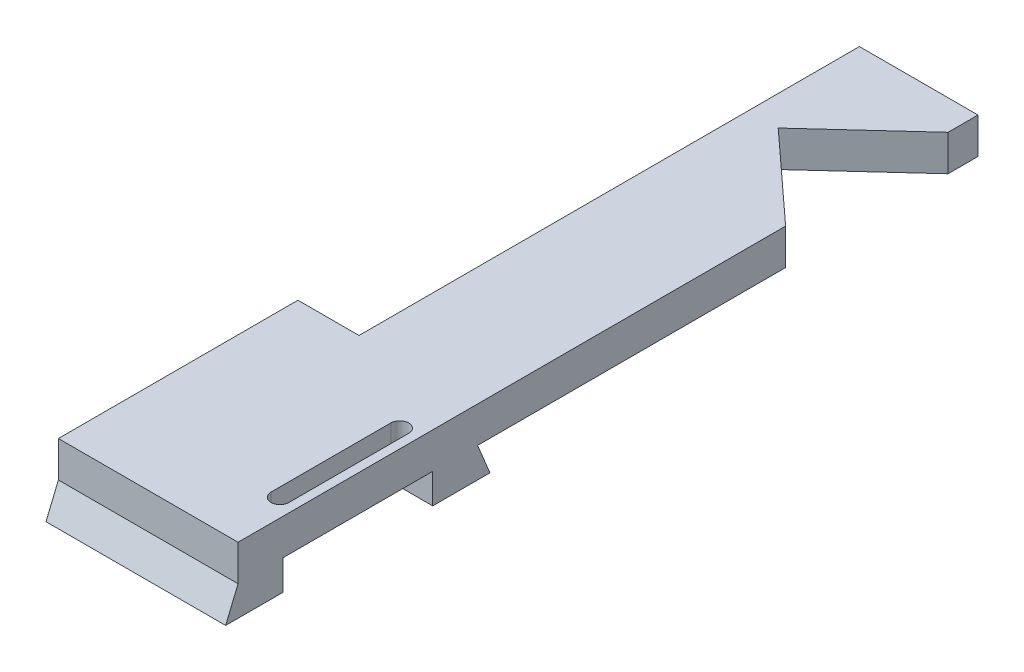
ISO-10303-21;
HEADER;
FILE_DESCRIPTION(('STEP AP214'),'2;1');
FILE_NAME('part.step','',(''),(''),'','','');
FILE_SCHEMA(('AUTOMOTIVE_DESIGN { 1 0 10303 214 1 1 1 1 }'));
ENDSEC;
DATA;
#1=APPLICATION_CONTEXT('core data for automotive mechanical design processes');
#2=APPLICATION_PROTOCOL_DEFINITION('international standard','automotive_design',2000,#1);
#3=PRODUCT_CONTEXT('',#1,'mechanical');
#4=PRODUCT('Part','Part','',(#3));
#5=PRODUCT_RELATED_PRODUCT_CATEGORY('part','',(#4));
#6=PRODUCT_DEFINITION_FORMATION('','',#4);
#7=PRODUCT_DEFINITION_CONTEXT('part definition',#1,'design');
#8=PRODUCT_DEFINITION('design','',#6,#7);
#9=PRODUCT_DEFINITION_SHAPE('','',#8);
#10=(LENGTH_UNIT() NAMED_UNIT(*) SI_UNIT(.MILLI.,.METRE.));
#11=(NAMED_UNIT(*) PLANE_ANGLE_UNIT() SI_UNIT($,.RADIAN.));
#12=(NAMED_UNIT(*) SI_UNIT($,.STERADIAN.) SOLID_ANGLE_UNIT());
#13=UNCERTAINTY_MEASURE_WITH_UNIT(LENGTH_MEASURE(1.E-05),#10,'distance_accuracy_value','');
#14=(GEOMETRIC_REPRESENTATION_CONTEXT(3) GLOBAL_UNCERTAINTY_ASSIGNED_CONTEXT((#13)) GLOBAL_UNIT_ASSIGNED_CONTEXT((#10,
#11,#12)) REPRESENTATION_CONTEXT('',''));
#15=CARTESIAN_POINT('',(0.,0.,0.));
#16=DIRECTION('',(0.,0.,1.));
#17=DIRECTION('',(1.,0.,0.));
#18=AXIS2_PLACEMENT_3D('',#15,#16,#17);
#19=CARTESIAN_POINT('',(0.,6.,0.));
#20=DIRECTION('',(1.,0.,0.));
#21=DIRECTION('',(0.,0.,-1.));
#22=AXIS2_PLACEMENT_3D('',#19,#20,#21);
#23=PLANE('',#22);
#24=DIRECTION('',(0.,0.,1.));
#25=VECTOR('',#24,1.);
#26=CARTESIAN_POINT('',(0.,0.,0.));
#27=LINE('',#26,#25);
#28=CARTESIAN_POINT('',(0.,0.,-12.5));
#29=VERTEX_POINT('',#28);
#30=CARTESIAN_POINT('',(0.,0.,12.5));
#31=VERTEX_POINT('',#30);
#32=EDGE_CURVE('E213',#29,#31,#27,.T.);
#33=ORIENTED_EDGE('',*,*,#32,.F.);
#34=DIRECTION('',(0.,1.,0.));
#35=VECTOR('',#34,1.);
#36=CARTESIAN_POINT('',(0.,0.,-12.5));
#37=LINE('',#36,#35);
#38=CARTESIAN_POINT('',(0.,-5.,-12.5));
#39=VERTEX_POINT('',#38);
#40=EDGE_CURVE('E267',#39,#29,#37,.T.);
#41=ORIENTED_EDGE('',*,*,#40,.F.);
#42=DIRECTION('',(0.,0.,-1.));
#43=VECTOR('',#42,1.);
#44=CARTESIAN_POINT('',(0.,-5.,0.));
#45=LINE('',#44,#43);
#46=CARTESIAN_POINT('',(0.,-5.,-22.069851171331));
#47=VERTEX_POINT('',#46);
#48=EDGE_CURVE('E251',#39,#47,#45,.T.);
#49=ORIENTED_EDGE('',*,*,#48,.T.);
#50=DIRECTION('',(0.,0.923959000291111,0.382491523802882));
#51=VECTOR('',#50,1.);
#52=CARTESIAN_POINT('',(0.,7.0681297190547,-17.074004684379));
#53=LINE('',#52,#51);
#54=CARTESIAN_POINT('',(0.,0.,-20.));
#55=VERTEX_POINT('',#54);
#56=EDGE_CURVE('E268',#47,#55,#53,.T.);
#57=ORIENTED_EDGE('',*,*,#56,.T.);
#58=DIRECTION('',(0.,0.,1.));
#59=VECTOR('',#58,1.);
#60=CARTESIAN_POINT('',(0.,0.,-71.4365829509075));
#61=LINE('',#60,#59);
#62=CARTESIAN_POINT('',(0.,0.,-71.4365829509075));
#63=VERTEX_POINT('',#62);
#64=EDGE_CURVE('E332',#63,#55,#61,.T.);
#65=ORIENTED_EDGE('',*,*,#64,.F.);
#66=DIRECTION('',(0.,1.,0.));
#67=VECTOR('',#66,1.);
#68=CARTESIAN_POINT('',(0.,-85.8775804075977,-71.4365829509075));
#69=LINE('',#68,#67);
#70=CARTESIAN_POINT('',(0.,6.,-71.4365829509075));
#71=VERTEX_POINT('',#70);
#72=EDGE_CURVE('E187',#63,#71,#69,.T.);
#73=ORIENTED_EDGE('',*,*,#72,.T.);
#74=DIRECTION('',(0.,0.,1.));
#75=VECTOR('',#74,1.);
#76=CARTESIAN_POINT('',(0.,6.,0.));
#77=LINE('',#76,#75);
#78=CARTESIAN_POINT('',(0.,6.,20.));
#79=VERTEX_POINT('',#78);
#80=EDGE_CURVE('E202',#71,#79,#77,.T.);
#81=ORIENTED_EDGE('',*,*,#80,.T.);
#82=DIRECTION('',(0.,-1.,0.));
#83=VECTOR('',#82,1.);
#84=CARTESIAN_POINT('',(0.,6.,20.));
#85=LINE('',#84,#83);
#86=CARTESIAN_POINT('',(0.,0.,20.));
#87=VERTEX_POINT('',#86);
#88=EDGE_CURVE('E212',#79,#87,#85,.T.);
#89=ORIENTED_EDGE('',*,*,#88,.T.);
#90=DIRECTION('',(0.,0.923959000291111,-0.382491523802882));
#91=VECTOR('',#90,1.);
#92=CARTESIAN_POINT('',(0.,7.06812971905469,17.074004684379));
#93=LINE('',#92,#91);
#94=CARTESIAN_POINT('',(0.,-5.,22.069851171331));
#95=VERTEX_POINT('',#94);
#96=EDGE_CURVE('E291',#95,#87,#93,.T.);
#97=ORIENTED_EDGE('',*,*,#96,.F.);
#98=DIRECTION('',(0.,0.,1.));
#99=VECTOR('',#98,1.);
#100=CARTESIAN_POINT('',(0.,-5.,0.));
#101=LINE('',#100,#99);
#102=CARTESIAN_POINT('',(0.,-5.,12.5));
#103=VERTEX_POINT('',#102);
#104=EDGE_CURVE('E286',#103,#95,#101,.T.);
#105=ORIENTED_EDGE('',*,*,#104,.F.);
#106=DIRECTION('',(0.,1.,0.));
#107=VECTOR('',#106,1.);
#108=CARTESIAN_POINT('',(0.,0.,12.5));
#109=LINE('',#108,#107);
#110=EDGE_CURVE('E272',#103,#31,#109,.T.);
#111=ORIENTED_EDGE('',*,*,#110,.T.);
#112=EDGE_LOOP('',(#33,#41,#49,#57,#65,#73,#81,#89,#97,#105,#111));
#113=FACE_BOUND('',#112,.T.);
#114=ADVANCED_FACE('F41',(#113),#23,.T.);
#115=CARTESIAN_POINT('',(0.,6.,-20.));
#116=DIRECTION('',(0.,0.,-1.));
#117=DIRECTION('',(-1.,0.,0.));
#118=AXIS2_PLACEMENT_3D('',#115,#116,#117);
#119=PLANE('',#118);
#120=DIRECTION('',(0.,1.,0.));
#121=VECTOR('',#120,1.);
#122=CARTESIAN_POINT('',(-19.8018723292226,-85.8775804075977,-20.));
#123=LINE('',#122,#121);
#124=CARTESIAN_POINT('',(-19.8018723292226,0.,-20.));
#125=VERTEX_POINT('',#124);
#126=CARTESIAN_POINT('',(-19.8018723292226,6.,-20.));
#127=VERTEX_POINT('',#126);
#128=EDGE_CURVE('E176',#125,#127,#123,.T.);
#129=ORIENTED_EDGE('',*,*,#128,.F.);
#130=DIRECTION('',(1.,0.,0.));
#131=VECTOR('',#130,1.);
#132=CARTESIAN_POINT('',(0.,0.,-20.));
#133=LINE('',#132,#131);
#134=CARTESIAN_POINT('',(-30.,0.,-20.));
#135=VERTEX_POINT('',#134);
#136=EDGE_CURVE('E215',#135,#125,#133,.T.);
#137=ORIENTED_EDGE('',*,*,#136,.F.);
#138=DIRECTION('',(0.,-1.,0.));
#139=VECTOR('',#138,1.);
#140=CARTESIAN_POINT('',(-30.,6.,-20.));
#141=LINE('',#140,#139);
#142=CARTESIAN_POINT('',(-30.,6.,-20.));
#143=VERTEX_POINT('',#142);
#144=EDGE_CURVE('E199',#143,#135,#141,.T.);
#145=ORIENTED_EDGE('',*,*,#144,.F.);
#146=DIRECTION('',(1.,0.,0.));
#147=VECTOR('',#146,1.);
#148=CARTESIAN_POINT('',(0.,6.,-20.));
#149=LINE('',#148,#147);
#150=EDGE_CURVE('E193',#143,#127,#149,.T.);
#151=ORIENTED_EDGE('',*,*,#150,.T.);
#152=EDGE_LOOP('',(#129,#137,#145,#151));
#153=FACE_BOUND('',#152,.T.);
#154=ADVANCED_FACE('F198',(#153),#119,.T.);
#155=CARTESIAN_POINT('',(-30.,6.,0.));
#156=DIRECTION('',(1.,0.,0.));
#157=DIRECTION('',(0.,0.,-1.));
#158=AXIS2_PLACEMENT_3D('',#155,#156,#157);
#159=PLANE('',#158);
#160=ORIENTED_EDGE('',*,*,#144,.T.);
#161=DIRECTION('',(0.,0.923959000291111,0.382491523802882));
#162=VECTOR('',#161,1.);
#163=CARTESIAN_POINT('',(-30.,7.0681297190547,-17.074004684379));
#164=LINE('',#163,#162);
#165=CARTESIAN_POINT('',(-30.,-5.,-22.069851171331));
#166=VERTEX_POINT('',#165);
#167=EDGE_CURVE('E259',#166,#135,#164,.T.);
#168=ORIENTED_EDGE('',*,*,#167,.F.);
#169=DIRECTION('',(0.,0.,-1.));
#170=VECTOR('',#169,1.);
#171=CARTESIAN_POINT('',(-30.,-5.,0.));
#172=LINE('',#171,#170);
#173=CARTESIAN_POINT('',(-30.,-5.,-12.5));
#174=VERTEX_POINT('',#173);
#175=EDGE_CURVE('E269',#174,#166,#172,.T.);
#176=ORIENTED_EDGE('',*,*,#175,.F.);
#177=DIRECTION('',(0.,1.,0.));
#178=VECTOR('',#177,1.);
#179=CARTESIAN_POINT('',(-30.,0.,-12.5));
#180=LINE('',#179,#178);
#181=CARTESIAN_POINT('',(-30.,0.,-12.5));
#182=VERTEX_POINT('',#181);
#183=EDGE_CURVE('E264',#174,#182,#180,.T.);
#184=ORIENTED_EDGE('',*,*,#183,.T.);
#185=DIRECTION('',(0.,0.,1.));
#186=VECTOR('',#185,1.);
#187=CARTESIAN_POINT('',(-30.,0.,0.));
#188=LINE('',#187,#186);
#189=CARTESIAN_POINT('',(-30.,0.,12.5));
#190=VERTEX_POINT('',#189);
#191=EDGE_CURVE('E218',#182,#190,#188,.T.);
#192=ORIENTED_EDGE('',*,*,#191,.T.);
#193=DIRECTION('',(0.,1.,0.));
#194=VECTOR('',#193,1.);
#195=CARTESIAN_POINT('',(-30.,0.,12.5));
#196=LINE('',#195,#194);
#197=CARTESIAN_POINT('',(-30.,-5.,12.5));
#198=VERTEX_POINT('',#197);
#199=EDGE_CURVE('E283',#198,#190,#196,.T.);
#200=ORIENTED_EDGE('',*,*,#199,.F.);
#201=DIRECTION('',(0.,0.,1.));
#202=VECTOR('',#201,1.);
#203=CARTESIAN_POINT('',(-30.,-5.,0.));
#204=LINE('',#203,#202);
#205=CARTESIAN_POINT('',(-30.,-5.,22.069851171331));
#206=VERTEX_POINT('',#205);
#207=EDGE_CURVE('E292',#198,#206,#204,.T.);
#208=ORIENTED_EDGE('',*,*,#207,.T.);
#209=DIRECTION('',(0.,0.923959000291111,-0.382491523802882));
#210=VECTOR('',#209,1.);
#211=CARTESIAN_POINT('',(-30.,7.06812971905469,17.074004684379));
#212=LINE('',#211,#210);
#213=CARTESIAN_POINT('',(-30.,0.,20.));
#214=VERTEX_POINT('',#213);
#215=EDGE_CURVE('E288',#206,#214,#212,.T.);
#216=ORIENTED_EDGE('',*,*,#215,.T.);
#217=DIRECTION('',(0.,-1.,0.));
#218=VECTOR('',#217,1.);
#219=CARTESIAN_POINT('',(-30.,6.,20.));
#220=LINE('',#219,#218);
#221=CARTESIAN_POINT('',(-30.,6.,20.));
#222=VERTEX_POINT('',#221);
#223=EDGE_CURVE('E224',#222,#214,#220,.T.);
#224=ORIENTED_EDGE('',*,*,#223,.F.);
#225=DIRECTION('',(0.,0.,1.));
#226=VECTOR('',#225,1.);
#227=CARTESIAN_POINT('',(-30.,6.,0.));
#228=LINE('',#227,#226);
#229=EDGE_CURVE('E201',#143,#222,#228,.T.);
#230=ORIENTED_EDGE('',*,*,#229,.F.);
#231=EDGE_LOOP('',(#160,#168,#176,#184,#192,#200,#208,#216,#224,#230));
#232=FACE_BOUND('',#231,.T.);
#233=ADVANCED_FACE('F314',(#232),#159,.F.);
#234=CARTESIAN_POINT('',(0.,6.,20.));
#235=DIRECTION('',(0.,0.,-1.));
#236=DIRECTION('',(-1.,0.,0.));
#237=AXIS2_PLACEMENT_3D('',#234,#235,#236);
#238=PLANE('',#237);
#239=DIRECTION('',(1.,0.,0.));
#240=VECTOR('',#239,1.);
#241=CARTESIAN_POINT('',(0.,0.,20.));
#242=LINE('',#241,#240);
#243=EDGE_CURVE('E207',#214,#87,#242,.T.);
#244=ORIENTED_EDGE('',*,*,#243,.T.);
#245=ORIENTED_EDGE('',*,*,#88,.F.);
#246=DIRECTION('',(1.,0.,0.));
#247=VECTOR('',#246,1.);
#248=CARTESIAN_POINT('',(0.,6.,20.));
#249=LINE('',#248,#247);
#250=EDGE_CURVE('E204',#222,#79,#249,.T.);
#251=ORIENTED_EDGE('',*,*,#250,.F.);
#252=ORIENTED_EDGE('',*,*,#223,.T.);
#253=EDGE_LOOP('',(#244,#245,#251,#252));
#254=FACE_BOUND('',#253,.T.);
#255=ADVANCED_FACE('F325',(#254),#238,.F.);
#256=CARTESIAN_POINT('',(0.,6.,0.));
#257=DIRECTION('',(0.,1.,0.));
#258=DIRECTION('',(0.,0.,1.));
#259=AXIS2_PLACEMENT_3D('',#256,#257,#258);
#260=PLANE('',#259);
#261=CARTESIAN_POINT('',(-3.,6.,-10.));
#262=DIRECTION('',(0.,1.,0.));
#263=DIRECTION('',(0.,0.,1.));
#264=AXIS2_PLACEMENT_3D('',#261,#262,#263);
#265=CIRCLE('',#264,1.5);
#266=CARTESIAN_POINT('',(-1.5,6.,-10.));
#267=VERTEX_POINT('',#266);
#268=CARTESIAN_POINT('',(-4.5,6.,-10.));
#269=VERTEX_POINT('',#268);
#270=EDGE_CURVE('E55',#267,#269,#265,.T.);
#271=ORIENTED_EDGE('',*,*,#270,.F.);
#272=DIRECTION('',(0.,0.,-1.));
#273=VECTOR('',#272,1.);
#274=CARTESIAN_POINT('',(-1.5,6.,-10.));
#275=LINE('',#274,#273);
#276=CARTESIAN_POINT('',(-1.5,6.,10.));
#277=VERTEX_POINT('',#276);
#278=EDGE_CURVE('E258',#277,#267,#275,.T.);
#279=ORIENTED_EDGE('',*,*,#278,.F.);
#280=CARTESIAN_POINT('',(-3.,6.,10.));
#281=DIRECTION('',(0.,1.,0.));
#282=DIRECTION('',(0.,0.,1.));
#283=AXIS2_PLACEMENT_3D('',#280,#281,#282);
#284=CIRCLE('',#283,1.5);
#285=CARTESIAN_POINT('',(-4.5,6.,10.));
#286=VERTEX_POINT('',#285);
#287=EDGE_CURVE('E248',#286,#277,#284,.T.);
#288=ORIENTED_EDGE('',*,*,#287,.F.);
#289=DIRECTION('',(0.,0.,1.));
#290=VECTOR('',#289,1.);
#291=CARTESIAN_POINT('',(-4.5,6.,-10.));
#292=LINE('',#291,#290);
#293=EDGE_CURVE('E358',#269,#286,#292,.T.);
#294=ORIENTED_EDGE('',*,*,#293,.F.);
#295=EDGE_LOOP('',(#271,#279,#288,#294));
#296=FACE_BOUND('',#295,.T.);
#297=ORIENTED_EDGE('',*,*,#80,.F.);
#298=DIRECTION('',(-0.737277336810125,0.,-0.675590207615659));
#299=VECTOR('',#298,1.);
#300=CARTESIAN_POINT('',(0.,6.,-71.4365829509075));
#301=LINE('',#300,#299);
#302=CARTESIAN_POINT('',(-14.8018723292226,6.,-85.));
#303=VERTEX_POINT('',#302);
#304=EDGE_CURVE('E196',#71,#303,#301,.T.);
#305=ORIENTED_EDGE('',*,*,#304,.T.);
#306=DIRECTION('',(0.737277336810125,0.,-0.675590207615659));
#307=VECTOR('',#306,1.);
#308=CARTESIAN_POINT('',(-14.8018723292226,6.,-85.));
#309=LINE('',#308,#307);
#310=CARTESIAN_POINT('',(0.,6.,-98.5634170490925));
#311=VERTEX_POINT('',#310);
#312=EDGE_CURVE('E340',#303,#311,#309,.T.);
#313=ORIENTED_EDGE('',*,*,#312,.T.);
#314=DIRECTION('',(0.,0.,-1.));
#315=VECTOR('',#314,1.);
#316=CARTESIAN_POINT('',(0.,6.,-103.563417049093));
#317=LINE('',#316,#315);
#318=CARTESIAN_POINT('',(0.,6.,-103.563417049093));
#319=VERTEX_POINT('',#318);
#320=EDGE_CURVE('E342',#311,#319,#317,.T.);
#321=ORIENTED_EDGE('',*,*,#320,.T.);
#322=DIRECTION('',(-1.,0.,0.));
#323=VECTOR('',#322,1.);
#324=CARTESIAN_POINT('',(-19.8018723292226,6.,-103.563417049093));
#325=LINE('',#324,#323);
#326=CARTESIAN_POINT('',(-19.8018723292226,6.,-103.563417049093));
#327=VERTEX_POINT('',#326);
#328=EDGE_CURVE('E188',#319,#327,#325,.T.);
#329=ORIENTED_EDGE('',*,*,#328,.T.);
#330=DIRECTION('',(0.,0.,1.));
#331=VECTOR('',#330,1.);
#332=CARTESIAN_POINT('',(-19.8018723292226,6.,-103.563417049093));
#333=LINE('',#332,#331);
#334=EDGE_CURVE('E180',#327,#127,#333,.T.);
#335=ORIENTED_EDGE('',*,*,#334,.T.);
#336=ORIENTED_EDGE('',*,*,#150,.F.);
#337=ORIENTED_EDGE('',*,*,#229,.T.);
#338=ORIENTED_EDGE('',*,*,#250,.T.);
#339=EDGE_LOOP('',(#297,#305,#313,#321,#329,#335,#336,#337,#338));
#340=FACE_BOUND('',#339,.T.);
#341=ADVANCED_FACE('F192',(#296,#340),#260,.T.);
#342=CARTESIAN_POINT('',(0.,0.,0.));
#343=DIRECTION('',(0.,1.,0.));
#344=DIRECTION('',(0.,0.,1.));
#345=AXIS2_PLACEMENT_3D('',#342,#343,#344);
#346=PLANE('',#345);
#347=DIRECTION('',(0.,0.,-1.));
#348=VECTOR('',#347,1.);
#349=CARTESIAN_POINT('',(-1.5,0.,0.));
#350=LINE('',#349,#348);
#351=CARTESIAN_POINT('',(-1.5,0.,10.));
#352=VERTEX_POINT('',#351);
#353=CARTESIAN_POINT('',(-1.5,0.,-10.));
#354=VERTEX_POINT('',#353);
#355=EDGE_CURVE('E48',#352,#354,#350,.T.);
#356=ORIENTED_EDGE('',*,*,#355,.T.);
#357=CARTESIAN_POINT('',(-3.,0.,-10.));
#358=DIRECTION('',(0.,1.,0.));
#359=DIRECTION('',(0.,0.,1.));
#360=AXIS2_PLACEMENT_3D('',#357,#358,#359);
#361=CIRCLE('',#360,1.5);
#362=CARTESIAN_POINT('',(-4.5,0.,-10.));
#363=VERTEX_POINT('',#362);
#364=EDGE_CURVE('E11',#354,#363,#361,.T.);
#365=ORIENTED_EDGE('',*,*,#364,.T.);
#366=DIRECTION('',(0.,0.,1.));
#367=VECTOR('',#366,1.);
#368=CARTESIAN_POINT('',(-4.5,0.,0.));
#369=LINE('',#368,#367);
#370=CARTESIAN_POINT('',(-4.5,0.,10.));
#371=VERTEX_POINT('',#370);
#372=EDGE_CURVE('E228',#363,#371,#369,.T.);
#373=ORIENTED_EDGE('',*,*,#372,.T.);
#374=CARTESIAN_POINT('',(-3.,0.,10.));
#375=DIRECTION('',(0.,1.,0.));
#376=DIRECTION('',(0.,0.,1.));
#377=AXIS2_PLACEMENT_3D('',#374,#375,#376);
#378=CIRCLE('',#377,1.5);
#379=EDGE_CURVE('E231',#371,#352,#378,.T.);
#380=ORIENTED_EDGE('',*,*,#379,.T.);
#381=EDGE_LOOP('',(#356,#365,#373,#380));
#382=FACE_BOUND('',#381,.T.);
#383=ORIENTED_EDGE('',*,*,#191,.F.);
#384=DIRECTION('',(-1.,0.,0.));
#385=VECTOR('',#384,1.);
#386=CARTESIAN_POINT('',(10.7973168630649,0.,-12.5));
#387=LINE('',#386,#385);
#388=EDGE_CURVE('E275',#29,#182,#387,.T.);
#389=ORIENTED_EDGE('',*,*,#388,.F.);
#390=ORIENTED_EDGE('',*,*,#32,.T.);
#391=DIRECTION('',(-1.,0.,0.));
#392=VECTOR('',#391,1.);
#393=CARTESIAN_POINT('',(10.7973168630649,0.,12.5));
#394=LINE('',#393,#392);
#395=EDGE_CURVE('E296',#31,#190,#394,.T.);
#396=ORIENTED_EDGE('',*,*,#395,.T.);
#397=EDGE_LOOP('',(#383,#389,#390,#396));
#398=FACE_BOUND('',#397,.T.);
#399=ADVANCED_FACE('F235',(#382,#398),#346,.F.);
#400=CARTESIAN_POINT('',(10.7973168630649,7.06812971905469,17.074004684379));
#401=DIRECTION('',(0.,0.382491523802882,0.923959000291111));
#402=DIRECTION('',(0.,-0.923959000291111,0.382491523802882));
#403=AXIS2_PLACEMENT_3D('',#400,#401,#402);
#404=PLANE('',#403);
#405=DIRECTION('',(-1.,0.,0.));
#406=VECTOR('',#405,1.);
#407=CARTESIAN_POINT('',(10.7973168630649,-5.,22.069851171331));
#408=LINE('',#407,#406);
#409=EDGE_CURVE('E216',#95,#206,#408,.T.);
#410=ORIENTED_EDGE('',*,*,#409,.F.);
#411=ORIENTED_EDGE('',*,*,#96,.T.);
#412=ORIENTED_EDGE('',*,*,#243,.F.);
#413=ORIENTED_EDGE('',*,*,#215,.F.);
#414=EDGE_LOOP('',(#410,#411,#412,#413));
#415=FACE_BOUND('',#414,.T.);
#416=ADVANCED_FACE('F310',(#415),#404,.T.);
#417=CARTESIAN_POINT('',(10.7973168630649,0.,12.5));
#418=DIRECTION('',(0.,0.,1.));
#419=DIRECTION('',(1.,0.,0.));
#420=AXIS2_PLACEMENT_3D('',#417,#418,#419);
#421=PLANE('',#420);
#422=ORIENTED_EDGE('',*,*,#110,.F.);
#423=DIRECTION('',(-1.,0.,0.));
#424=VECTOR('',#423,1.);
#425=CARTESIAN_POINT('',(10.7973168630649,-5.,12.5));
#426=LINE('',#425,#424);
#427=EDGE_CURVE('E287',#103,#198,#426,.T.);
#428=ORIENTED_EDGE('',*,*,#427,.T.);
#429=ORIENTED_EDGE('',*,*,#199,.T.);
#430=ORIENTED_EDGE('',*,*,#395,.F.);
#431=EDGE_LOOP('',(#422,#428,#429,#430));
#432=FACE_BOUND('',#431,.T.);
#433=ADVANCED_FACE('F318',(#432),#421,.F.);
#434=CARTESIAN_POINT('',(10.7973168630649,-5.,0.));
#435=DIRECTION('',(0.,-1.,0.));
#436=DIRECTION('',(0.,0.,-1.));
#437=AXIS2_PLACEMENT_3D('',#434,#435,#436);
#438=PLANE('',#437);
#439=ORIENTED_EDGE('',*,*,#427,.F.);
#440=ORIENTED_EDGE('',*,*,#104,.T.);
#441=ORIENTED_EDGE('',*,*,#409,.T.);
#442=ORIENTED_EDGE('',*,*,#207,.F.);
#443=EDGE_LOOP('',(#439,#440,#441,#442));
#444=FACE_BOUND('',#443,.T.);
#445=ADVANCED_FACE('F308',(#444),#438,.T.);
#446=CARTESIAN_POINT('',(10.7973168630649,0.,-12.5));
#447=DIRECTION('',(0.,0.,1.));
#448=DIRECTION('',(1.,0.,0.));
#449=AXIS2_PLACEMENT_3D('',#446,#447,#448);
#450=PLANE('',#449);
#451=DIRECTION('',(-1.,0.,0.));
#452=VECTOR('',#451,1.);
#453=CARTESIAN_POINT('',(10.7973168630649,-5.,-12.5));
#454=LINE('',#453,#452);
#455=EDGE_CURVE('E262',#39,#174,#454,.T.);
#456=ORIENTED_EDGE('',*,*,#455,.F.);
#457=ORIENTED_EDGE('',*,*,#40,.T.);
#458=ORIENTED_EDGE('',*,*,#388,.T.);
#459=ORIENTED_EDGE('',*,*,#183,.F.);
#460=EDGE_LOOP('',(#456,#457,#458,#459));
#461=FACE_BOUND('',#460,.T.);
#462=ADVANCED_FACE('F397',(#461),#450,.T.);
#463=CARTESIAN_POINT('',(10.7973168630649,7.0681297190547,-17.074004684379));
#464=DIRECTION('',(0.,-0.382491523802882,0.923959000291111));
#465=DIRECTION('',(0.,-0.923959000291111,-0.382491523802882));
#466=AXIS2_PLACEMENT_3D('',#463,#464,#465);
#467=PLANE('',#466);
#468=ORIENTED_EDGE('',*,*,#56,.F.);
#469=DIRECTION('',(-1.,0.,0.));
#470=VECTOR('',#469,1.);
#471=CARTESIAN_POINT('',(10.7973168630649,-5.,-22.069851171331));
#472=LINE('',#471,#470);
#473=EDGE_CURVE('E263',#47,#166,#472,.T.);
#474=ORIENTED_EDGE('',*,*,#473,.T.);
#475=ORIENTED_EDGE('',*,*,#167,.T.);
#476=ORIENTED_EDGE('',*,*,#136,.T.);
#477=DIRECTION('',(-1.,0.,0.));
#478=VECTOR('',#477,1.);
#479=CARTESIAN_POINT('',(-19.8018723292226,0.,-20.));
#480=LINE('',#479,#478);
#481=EDGE_CURVE('E355',#55,#125,#480,.T.);
#482=ORIENTED_EDGE('',*,*,#481,.F.);
#483=EDGE_LOOP('',(#468,#474,#475,#476,#482));
#484=FACE_BOUND('',#483,.T.);
#485=ADVANCED_FACE('F372',(#484),#467,.F.);
#486=CARTESIAN_POINT('',(10.7973168630649,-5.,0.));
#487=DIRECTION('',(0.,1.,0.));
#488=DIRECTION('',(0.,0.,1.));
#489=AXIS2_PLACEMENT_3D('',#486,#487,#488);
#490=PLANE('',#489);
#491=ORIENTED_EDGE('',*,*,#48,.F.);
#492=ORIENTED_EDGE('',*,*,#455,.T.);
#493=ORIENTED_EDGE('',*,*,#175,.T.);
#494=ORIENTED_EDGE('',*,*,#473,.F.);
#495=EDGE_LOOP('',(#491,#492,#493,#494));
#496=FACE_BOUND('',#495,.T.);
#497=ADVANCED_FACE('F365',(#496),#490,.F.);
#498=CARTESIAN_POINT('',(-3.,-5.,-10.));
#499=DIRECTION('',(0.,1.,0.));
#500=DIRECTION('',(0.,0.,1.));
#501=AXIS2_PLACEMENT_3D('',#498,#499,#500);
#502=CYLINDRICAL_SURFACE('',#501,1.5);
#503=DIRECTION('',(0.,1.,0.));
#504=VECTOR('',#503,1.);
#505=CARTESIAN_POINT('',(-1.5,-5.,-10.));
#506=LINE('',#505,#504);
#507=EDGE_CURVE('E244',#354,#267,#506,.T.);
#508=ORIENTED_EDGE('',*,*,#507,.T.);
#509=ORIENTED_EDGE('',*,*,#270,.T.);
#510=DIRECTION('',(0.,1.,0.));
#511=VECTOR('',#510,1.);
#512=CARTESIAN_POINT('',(-4.5,-5.,-10.));
#513=LINE('',#512,#511);
#514=EDGE_CURVE('E253',#363,#269,#513,.T.);
#515=ORIENTED_EDGE('',*,*,#514,.F.);
#516=ORIENTED_EDGE('',*,*,#364,.F.);
#517=EDGE_LOOP('',(#508,#509,#515,#516));
#518=FACE_BOUND('',#517,.T.);
#519=ADVANCED_FACE('F363',(#518),#502,.F.);
#520=CARTESIAN_POINT('',(-1.5,-5.,-10.));
#521=DIRECTION('',(1.,0.,0.));
#522=DIRECTION('',(0.,0.,-1.));
#523=AXIS2_PLACEMENT_3D('',#520,#521,#522);
#524=PLANE('',#523);
#525=DIRECTION('',(0.,1.,0.));
#526=VECTOR('',#525,1.);
#527=CARTESIAN_POINT('',(-1.5,-5.,10.));
#528=LINE('',#527,#526);
#529=EDGE_CURVE('E242',#352,#277,#528,.T.);
#530=ORIENTED_EDGE('',*,*,#529,.T.);
#531=ORIENTED_EDGE('',*,*,#278,.T.);
#532=ORIENTED_EDGE('',*,*,#507,.F.);
#533=ORIENTED_EDGE('',*,*,#355,.F.);
#534=EDGE_LOOP('',(#530,#531,#532,#533));
#535=FACE_BOUND('',#534,.T.);
#536=ADVANCED_FACE('F240',(#535),#524,.F.);
#537=CARTESIAN_POINT('',(-3.,-5.,10.));
#538=DIRECTION('',(0.,1.,0.));
#539=DIRECTION('',(0.,0.,1.));
#540=AXIS2_PLACEMENT_3D('',#537,#538,#539);
#541=CYLINDRICAL_SURFACE('',#540,1.5);
#542=DIRECTION('',(0.,1.,0.));
#543=VECTOR('',#542,1.);
#544=CARTESIAN_POINT('',(-4.5,-5.,10.));
#545=LINE('',#544,#543);
#546=EDGE_CURVE('E63',#371,#286,#545,.T.);
#547=ORIENTED_EDGE('',*,*,#546,.T.);
#548=ORIENTED_EDGE('',*,*,#287,.T.);
#549=ORIENTED_EDGE('',*,*,#529,.F.);
#550=ORIENTED_EDGE('',*,*,#379,.F.);
#551=EDGE_LOOP('',(#547,#548,#549,#550));
#552=FACE_BOUND('',#551,.T.);
#553=ADVANCED_FACE('F246',(#552),#541,.F.);
#554=CARTESIAN_POINT('',(-4.5,-5.,-10.));
#555=DIRECTION('',(-1.,0.,0.));
#556=DIRECTION('',(0.,0.,1.));
#557=AXIS2_PLACEMENT_3D('',#554,#555,#556);
#558=PLANE('',#557);
#559=ORIENTED_EDGE('',*,*,#514,.T.);
#560=ORIENTED_EDGE('',*,*,#293,.T.);
#561=ORIENTED_EDGE('',*,*,#546,.F.);
#562=ORIENTED_EDGE('',*,*,#372,.F.);
#563=EDGE_LOOP('',(#559,#560,#561,#562));
#564=FACE_BOUND('',#563,.T.);
#565=ADVANCED_FACE('F362',(#564),#558,.F.);
#566=CARTESIAN_POINT('',(-19.8018723292226,-85.8775804075977,-103.563417049093));
#567=DIRECTION('',(-1.,0.,0.));
#568=DIRECTION('',(0.,0.,1.));
#569=AXIS2_PLACEMENT_3D('',#566,#567,#568);
#570=PLANE('',#569);
#571=DIRECTION('',(0.,0.,-1.));
#572=VECTOR('',#571,1.);
#573=CARTESIAN_POINT('',(-19.8018723292226,0.,-103.563417049093));
#574=LINE('',#573,#572);
#575=CARTESIAN_POINT('',(-19.8018723292226,0.,-103.563417049093));
#576=VERTEX_POINT('',#575);
#577=EDGE_CURVE('E182',#125,#576,#574,.T.);
#578=ORIENTED_EDGE('',*,*,#577,.F.);
#579=ORIENTED_EDGE('',*,*,#128,.T.);
#580=ORIENTED_EDGE('',*,*,#334,.F.);
#581=DIRECTION('',(0.,1.,0.));
#582=VECTOR('',#581,1.);
#583=CARTESIAN_POINT('',(-19.8018723292226,-85.8775804075977,-103.563417049093));
#584=LINE('',#583,#582);
#585=EDGE_CURVE('E348',#576,#327,#584,.T.);
#586=ORIENTED_EDGE('',*,*,#585,.F.);
#587=EDGE_LOOP('',(#578,#579,#580,#586));
#588=FACE_BOUND('',#587,.T.);
#589=ADVANCED_FACE('F178',(#588),#570,.T.);
#590=CARTESIAN_POINT('',(-19.8018723292226,-85.8775804075977,-103.563417049093));
#591=DIRECTION('',(0.,0.,-1.));
#592=DIRECTION('',(-1.,0.,0.));
#593=AXIS2_PLACEMENT_3D('',#590,#591,#592);
#594=PLANE('',#593);
#595=DIRECTION('',(1.,0.,0.));
#596=VECTOR('',#595,1.);
#597=CARTESIAN_POINT('',(-19.8018723292226,0.,-103.563417049093));
#598=LINE('',#597,#596);
#599=CARTESIAN_POINT('',(0.,0.,-103.563417049093));
#600=VERTEX_POINT('',#599);
#601=EDGE_CURVE('E423',#576,#600,#598,.T.);
#602=ORIENTED_EDGE('',*,*,#601,.F.);
#603=ORIENTED_EDGE('',*,*,#585,.T.);
#604=ORIENTED_EDGE('',*,*,#328,.F.);
#605=DIRECTION('',(0.,1.,0.));
#606=VECTOR('',#605,1.);
#607=CARTESIAN_POINT('',(0.,-85.8775804075977,-103.563417049093));
#608=LINE('',#607,#606);
#609=EDGE_CURVE('E350',#600,#319,#608,.T.);
#610=ORIENTED_EDGE('',*,*,#609,.F.);
#611=EDGE_LOOP('',(#602,#603,#604,#610));
#612=FACE_BOUND('',#611,.T.);
#613=ADVANCED_FACE('F432',(#612),#594,.T.);
#614=CARTESIAN_POINT('',(0.,-85.8775804075977,-103.563417049093));
#615=DIRECTION('',(1.,0.,0.));
#616=DIRECTION('',(0.,0.,-1.));
#617=AXIS2_PLACEMENT_3D('',#614,#615,#616);
#618=PLANE('',#617);
#619=DIRECTION('',(0.,0.,1.));
#620=VECTOR('',#619,1.);
#621=CARTESIAN_POINT('',(0.,0.,-103.563417049093));
#622=LINE('',#621,#620);
#623=CARTESIAN_POINT('',(0.,0.,-98.5634170490925));
#624=VERTEX_POINT('',#623);
#625=EDGE_CURVE('E421',#600,#624,#622,.T.);
#626=ORIENTED_EDGE('',*,*,#625,.F.);
#627=ORIENTED_EDGE('',*,*,#609,.T.);
#628=ORIENTED_EDGE('',*,*,#320,.F.);
#629=DIRECTION('',(0.,1.,0.));
#630=VECTOR('',#629,1.);
#631=CARTESIAN_POINT('',(0.,-85.8775804075977,-98.5634170490925));
#632=LINE('',#631,#630);
#633=EDGE_CURVE('E352',#624,#311,#632,.T.);
#634=ORIENTED_EDGE('',*,*,#633,.F.);
#635=EDGE_LOOP('',(#626,#627,#628,#634));
#636=FACE_BOUND('',#635,.T.);
#637=ADVANCED_FACE('F430',(#636),#618,.T.);
#638=CARTESIAN_POINT('',(-14.8018723292226,-85.8775804075977,-85.));
#639=DIRECTION('',(0.675590207615659,0.,0.737277336810125));
#640=DIRECTION('',(0.737277336810125,0.,-0.675590207615659));
#641=AXIS2_PLACEMENT_3D('',#638,#639,#640);
#642=PLANE('',#641);
#643=DIRECTION('',(-0.737277336810125,0.,0.675590207615659));
#644=VECTOR('',#643,1.);
#645=CARTESIAN_POINT('',(-14.8018723292226,0.,-85.));
#646=LINE('',#645,#644);
#647=CARTESIAN_POINT('',(-14.8018723292226,0.,-85.));
#648=VERTEX_POINT('',#647);
#649=EDGE_CURVE('E417',#624,#648,#646,.T.);
#650=ORIENTED_EDGE('',*,*,#649,.F.);
#651=ORIENTED_EDGE('',*,*,#633,.T.);
#652=ORIENTED_EDGE('',*,*,#312,.F.);
#653=DIRECTION('',(0.,1.,0.));
#654=VECTOR('',#653,1.);
#655=CARTESIAN_POINT('',(-14.8018723292226,-85.8775804075977,-85.));
#656=LINE('',#655,#654);
#657=EDGE_CURVE('E335',#648,#303,#656,.T.);
#658=ORIENTED_EDGE('',*,*,#657,.F.);
#659=EDGE_LOOP('',(#650,#651,#652,#658));
#660=FACE_BOUND('',#659,.T.);
#661=ADVANCED_FACE('F439',(#660),#642,.T.);
#662=CARTESIAN_POINT('',(0.,-85.8775804075977,-71.4365829509075));
#663=DIRECTION('',(0.675590207615659,0.,-0.737277336810125));
#664=DIRECTION('',(-0.737277336810125,0.,-0.675590207615659));
#665=AXIS2_PLACEMENT_3D('',#662,#663,#664);
#666=PLANE('',#665);
#667=DIRECTION('',(0.737277336810125,0.,0.675590207615659));
#668=VECTOR('',#667,1.);
#669=CARTESIAN_POINT('',(0.,0.,-71.4365829509075));
#670=LINE('',#669,#668);
#671=EDGE_CURVE('E415',#648,#63,#670,.T.);
#672=ORIENTED_EDGE('',*,*,#671,.F.);
#673=ORIENTED_EDGE('',*,*,#657,.T.);
#674=ORIENTED_EDGE('',*,*,#304,.F.);
#675=ORIENTED_EDGE('',*,*,#72,.F.);
#676=EDGE_LOOP('',(#672,#673,#674,#675));
#677=FACE_BOUND('',#676,.T.);
#678=ADVANCED_FACE('F337',(#677),#666,.T.);
#679=CARTESIAN_POINT('',(0.,0.,0.));
#680=DIRECTION('',(0.,1.,0.));
#681=DIRECTION('',(0.,0.,1.));
#682=AXIS2_PLACEMENT_3D('',#679,#680,#681);
#683=PLANE('',#682);
#684=ORIENTED_EDGE('',*,*,#577,.T.);
#685=ORIENTED_EDGE('',*,*,#601,.T.);
#686=ORIENTED_EDGE('',*,*,#625,.T.);
#687=ORIENTED_EDGE('',*,*,#649,.T.);
#688=ORIENTED_EDGE('',*,*,#671,.T.);
#689=ORIENTED_EDGE('',*,*,#64,.T.);
#690=ORIENTED_EDGE('',*,*,#481,.T.);
#691=EDGE_LOOP('',(#684,#685,#686,#687,#688,#689,#690));
#692=FACE_BOUND('',#691,.T.);
#693=ADVANCED_FACE('F413',(#692),#683,.F.);
#694=CLOSED_SHELL('',(#114,#154,#233,#255,#341,#399,#416,#433,#445,#462,#485,#497,#519,#536,
#553,#565,#589,#613,#637,#661,#678,#693));
#695=MANIFOLD_SOLID_BREP('B2',#694);
#696=ADVANCED_BREP_SHAPE_REPRESENTATION('',(#18,#695),#14);
#697=SHAPE_DEFINITION_REPRESENTATION(#9,#696);
ENDSEC;
END-ISO-10303-21;
